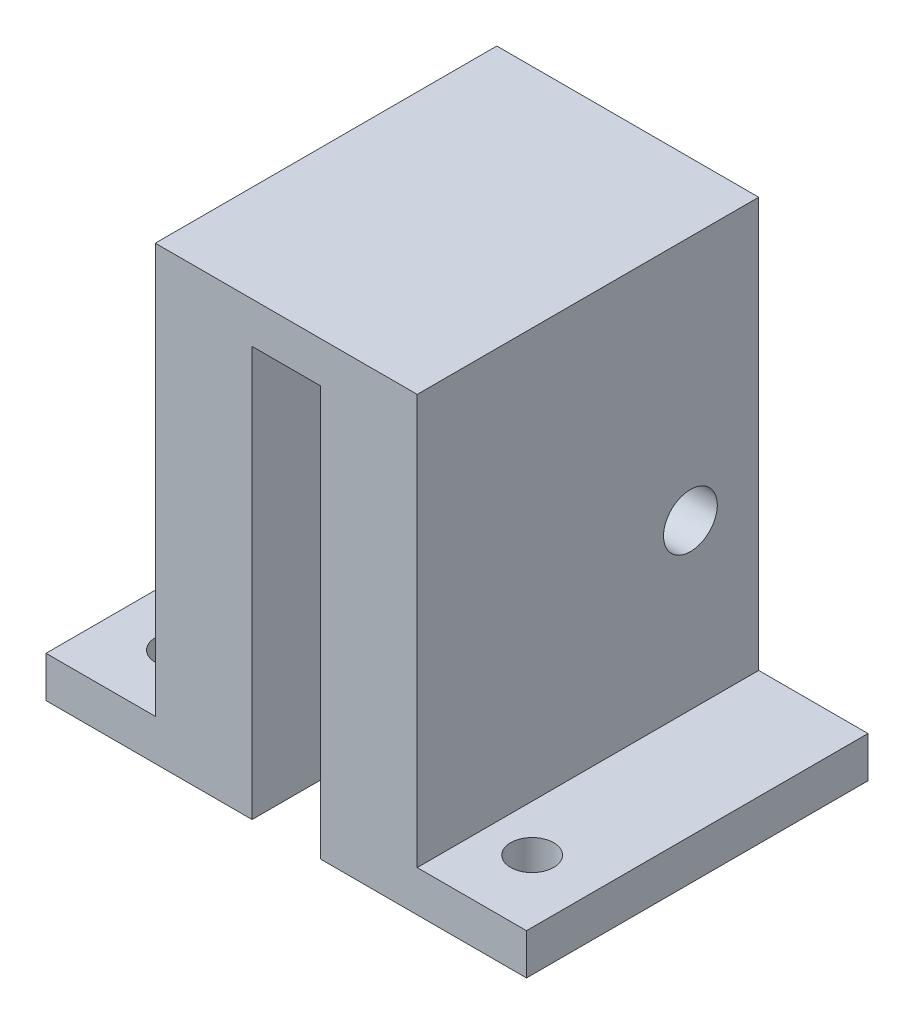
ISO-10303-21;
HEADER;
FILE_DESCRIPTION(('STEP AP214'),'2;1');
FILE_NAME('part.step','',(''),(''),'','','');
FILE_SCHEMA(('AUTOMOTIVE_DESIGN { 1 0 10303 214 1 1 1 1 }'));
ENDSEC;
DATA;
#1=APPLICATION_CONTEXT('core data for automotive mechanical design processes');
#2=APPLICATION_PROTOCOL_DEFINITION('international standard','automotive_design',2000,#1);
#3=PRODUCT_CONTEXT('',#1,'mechanical');
#4=PRODUCT('Part','Part','',(#3));
#5=PRODUCT_RELATED_PRODUCT_CATEGORY('part','',(#4));
#6=PRODUCT_DEFINITION_FORMATION('','',#4);
#7=PRODUCT_DEFINITION_CONTEXT('part definition',#1,'design');
#8=PRODUCT_DEFINITION('design','',#6,#7);
#9=PRODUCT_DEFINITION_SHAPE('','',#8);
#10=(LENGTH_UNIT() NAMED_UNIT(*) SI_UNIT(.MILLI.,.METRE.));
#11=(NAMED_UNIT(*) PLANE_ANGLE_UNIT() SI_UNIT($,.RADIAN.));
#12=(NAMED_UNIT(*) SI_UNIT($,.STERADIAN.) SOLID_ANGLE_UNIT());
#13=UNCERTAINTY_MEASURE_WITH_UNIT(LENGTH_MEASURE(1.E-05),#10,'distance_accuracy_value','');
#14=(GEOMETRIC_REPRESENTATION_CONTEXT(3) GLOBAL_UNCERTAINTY_ASSIGNED_CONTEXT((#13)) GLOBAL_UNIT_ASSIGNED_CONTEXT((#10,
#11,#12)) REPRESENTATION_CONTEXT('',''));
#15=CARTESIAN_POINT('',(0.,0.,0.));
#16=DIRECTION('',(0.,0.,1.));
#17=DIRECTION('',(1.,0.,0.));
#18=AXIS2_PLACEMENT_3D('',#15,#16,#17);
#19=CARTESIAN_POINT('',(-3.175,-38.1,31.75));
#20=DIRECTION('',(-1.,0.,0.));
#21=DIRECTION('',(0.,-1.,0.));
#22=AXIS2_PLACEMENT_3D('',#19,#20,#21);
#23=PLANE('',#22);
#24=DIRECTION('',(0.,1.,0.));
#25=VECTOR('',#24,1.);
#26=CARTESIAN_POINT('',(-3.175,-38.1,0.));
#27=LINE('',#26,#25);
#28=CARTESIAN_POINT('',(-3.175,-38.1,0.));
#29=VERTEX_POINT('',#28);
#30=CARTESIAN_POINT('',(-3.175,0.,0.));
#31=VERTEX_POINT('',#30);
#32=EDGE_CURVE('E216',#29,#31,#27,.T.);
#33=ORIENTED_EDGE('',*,*,#32,.T.);
#34=DIRECTION('',(0.,0.,-1.));
#35=VECTOR('',#34,1.);
#36=CARTESIAN_POINT('',(-3.175,0.,31.75));
#37=LINE('',#36,#35);
#38=CARTESIAN_POINT('',(-3.175,0.,31.75));
#39=VERTEX_POINT('',#38);
#40=EDGE_CURVE('E11',#39,#31,#37,.T.);
#41=ORIENTED_EDGE('',*,*,#40,.F.);
#42=DIRECTION('',(0.,1.,0.));
#43=VECTOR('',#42,1.);
#44=CARTESIAN_POINT('',(-3.175,-38.1,31.75));
#45=LINE('',#44,#43);
#46=CARTESIAN_POINT('',(-3.175,-38.1,31.75));
#47=VERTEX_POINT('',#46);
#48=EDGE_CURVE('E189',#47,#39,#45,.T.);
#49=ORIENTED_EDGE('',*,*,#48,.F.);
#50=DIRECTION('',(0.,0.,-1.));
#51=VECTOR('',#50,1.);
#52=CARTESIAN_POINT('',(-3.175,-38.1,31.75));
#53=LINE('',#52,#51);
#54=EDGE_CURVE('E215',#47,#29,#53,.T.);
#55=ORIENTED_EDGE('',*,*,#54,.T.);
#56=EDGE_LOOP('',(#33,#41,#49,#55));
#57=FACE_BOUND('',#56,.T.);
#58=DIRECTION('',(0.,-1.,0.));
#59=VECTOR('',#58,1.);
#60=CARTESIAN_POINT('',(-3.175,-20.4356406460551,8.55));
#61=LINE('',#60,#59);
#62=CARTESIAN_POINT('',(-3.175,-17.6643593539449,8.55));
#63=VERTEX_POINT('',#62);
#64=CARTESIAN_POINT('',(-3.175,-20.4356406460551,8.55));
#65=VERTEX_POINT('',#64);
#66=EDGE_CURVE('E165',#63,#65,#61,.T.);
#67=ORIENTED_EDGE('',*,*,#66,.F.);
#68=CARTESIAN_POINT('',(-3.175,-19.05,6.35));
#69=DIRECTION('',(-1.,0.,0.));
#70=DIRECTION('',(0.,-1.,0.));
#71=AXIS2_PLACEMENT_3D('',#68,#69,#70);
#72=CIRCLE('',#71,2.6);
#73=CARTESIAN_POINT('',(-3.175,-17.6643593539449,4.15));
#74=VERTEX_POINT('',#73);
#75=EDGE_CURVE('E149',#74,#63,#72,.F.);
#76=ORIENTED_EDGE('',*,*,#75,.F.);
#77=DIRECTION('',(0.,-1.,0.));
#78=VECTOR('',#77,1.);
#79=CARTESIAN_POINT('',(-3.175,-20.4356406460551,4.15));
#80=LINE('',#79,#78);
#81=CARTESIAN_POINT('',(-3.175,-20.4356406460551,4.14999999999999));
#82=VERTEX_POINT('',#81);
#83=EDGE_CURVE('E180',#74,#82,#80,.T.);
#84=ORIENTED_EDGE('',*,*,#83,.T.);
#85=CARTESIAN_POINT('',(-3.175,-19.05,6.35));
#86=DIRECTION('',(-1.,0.,0.));
#87=DIRECTION('',(0.,-1.,0.));
#88=AXIS2_PLACEMENT_3D('',#85,#86,#87);
#89=CIRCLE('',#88,2.6);
#90=EDGE_CURVE('E53',#65,#82,#89,.F.);
#91=ORIENTED_EDGE('',*,*,#90,.F.);
#92=EDGE_LOOP('',(#67,#76,#84,#91));
#93=FACE_BOUND('',#92,.T.);
#94=ADVANCED_FACE('F38',(#57,#93),#23,.F.);
#95=CARTESIAN_POINT('',(-12.175,3.81,31.75));
#96=DIRECTION('',(1.,0.,0.));
#97=DIRECTION('',(0.,1.,0.));
#98=AXIS2_PLACEMENT_3D('',#95,#96,#97);
#99=PLANE('',#98);
#100=DIRECTION('',(0.,-1.,0.));
#101=VECTOR('',#100,1.);
#102=CARTESIAN_POINT('',(-12.175,3.81,0.));
#103=LINE('',#102,#101);
#104=CARTESIAN_POINT('',(-12.175,3.81,0.));
#105=VERTEX_POINT('',#104);
#106=CARTESIAN_POINT('',(-12.175,-34.29,0.));
#107=VERTEX_POINT('',#106);
#108=EDGE_CURVE('E233',#105,#107,#103,.T.);
#109=ORIENTED_EDGE('',*,*,#108,.T.);
#110=DIRECTION('',(0.,0.,-1.));
#111=VECTOR('',#110,1.);
#112=CARTESIAN_POINT('',(-12.175,-34.29,31.75));
#113=LINE('',#112,#111);
#114=CARTESIAN_POINT('',(-12.175,-34.29,31.75));
#115=VERTEX_POINT('',#114);
#116=EDGE_CURVE('E248',#115,#107,#113,.T.);
#117=ORIENTED_EDGE('',*,*,#116,.F.);
#118=DIRECTION('',(0.,-1.,0.));
#119=VECTOR('',#118,1.);
#120=CARTESIAN_POINT('',(-12.175,3.81,31.75));
#121=LINE('',#120,#119);
#122=CARTESIAN_POINT('',(-12.175,3.81,31.75));
#123=VERTEX_POINT('',#122);
#124=EDGE_CURVE('E207',#123,#115,#121,.T.);
#125=ORIENTED_EDGE('',*,*,#124,.F.);
#126=DIRECTION('',(0.,0.,-1.));
#127=VECTOR('',#126,1.);
#128=CARTESIAN_POINT('',(-12.175,3.81,31.75));
#129=LINE('',#128,#127);
#130=EDGE_CURVE('E251',#123,#105,#129,.T.);
#131=ORIENTED_EDGE('',*,*,#130,.T.);
#132=EDGE_LOOP('',(#109,#117,#125,#131));
#133=FACE_BOUND('',#132,.T.);
#134=DIRECTION('',(0.,1.,0.));
#135=VECTOR('',#134,1.);
#136=CARTESIAN_POINT('',(-12.175,-20.4356406460551,4.15));
#137=LINE('',#136,#135);
#138=CARTESIAN_POINT('',(-12.175,-20.4356406460551,4.15));
#139=VERTEX_POINT('',#138);
#140=CARTESIAN_POINT('',(-12.175,-17.6643593539449,4.15));
#141=VERTEX_POINT('',#140);
#142=EDGE_CURVE('E175',#139,#141,#137,.T.);
#143=ORIENTED_EDGE('',*,*,#142,.T.);
#144=CARTESIAN_POINT('',(-12.175,-19.05,6.35));
#145=DIRECTION('',(-1.,0.,0.));
#146=DIRECTION('',(0.,1.,0.));
#147=AXIS2_PLACEMENT_3D('',#144,#145,#146);
#148=CIRCLE('',#147,2.6);
#149=CARTESIAN_POINT('',(-12.175,-17.6643593539449,8.55));
#150=VERTEX_POINT('',#149);
#151=EDGE_CURVE('E61',#150,#141,#148,.T.);
#152=ORIENTED_EDGE('',*,*,#151,.F.);
#153=DIRECTION('',(0.,1.,0.));
#154=VECTOR('',#153,1.);
#155=CARTESIAN_POINT('',(-12.175,-20.4356406460551,8.55));
#156=LINE('',#155,#154);
#157=CARTESIAN_POINT('',(-12.175,-20.4356406460551,8.55));
#158=VERTEX_POINT('',#157);
#159=EDGE_CURVE('E167',#158,#150,#156,.T.);
#160=ORIENTED_EDGE('',*,*,#159,.F.);
#161=CARTESIAN_POINT('',(-12.175,-19.05,6.35));
#162=DIRECTION('',(-1.,0.,0.));
#163=DIRECTION('',(0.,-1.,0.));
#164=AXIS2_PLACEMENT_3D('',#161,#162,#163);
#165=CIRCLE('',#164,2.6);
#166=EDGE_CURVE('E158',#139,#158,#165,.T.);
#167=ORIENTED_EDGE('',*,*,#166,.F.);
#168=EDGE_LOOP('',(#143,#152,#160,#167));
#169=FACE_BOUND('',#168,.T.);
#170=ADVANCED_FACE('F319',(#133,#169),#99,.F.);
#171=CARTESIAN_POINT('',(-3.175,0.,31.75));
#172=DIRECTION('',(0.,1.,0.));
#173=DIRECTION('',(0.,0.,1.));
#174=AXIS2_PLACEMENT_3D('',#171,#172,#173);
#175=PLANE('',#174);
#176=DIRECTION('',(1.,0.,0.));
#177=VECTOR('',#176,1.);
#178=CARTESIAN_POINT('',(-3.175,0.,0.));
#179=LINE('',#178,#177);
#180=CARTESIAN_POINT('',(3.175,0.,0.));
#181=VERTEX_POINT('',#180);
#182=EDGE_CURVE('E219',#31,#181,#179,.T.);
#183=ORIENTED_EDGE('',*,*,#182,.T.);
#184=DIRECTION('',(0.,0.,-1.));
#185=VECTOR('',#184,1.);
#186=CARTESIAN_POINT('',(3.175,0.,31.75));
#187=LINE('',#186,#185);
#188=CARTESIAN_POINT('',(3.175,0.,31.75));
#189=VERTEX_POINT('',#188);
#190=EDGE_CURVE('E46',#189,#181,#187,.T.);
#191=ORIENTED_EDGE('',*,*,#190,.F.);
#192=DIRECTION('',(1.,0.,0.));
#193=VECTOR('',#192,1.);
#194=CARTESIAN_POINT('',(-3.175,0.,31.75));
#195=LINE('',#194,#193);
#196=EDGE_CURVE('E192',#39,#189,#195,.T.);
#197=ORIENTED_EDGE('',*,*,#196,.F.);
#198=ORIENTED_EDGE('',*,*,#40,.T.);
#199=EDGE_LOOP('',(#183,#191,#197,#198));
#200=FACE_BOUND('',#199,.T.);
#201=ADVANCED_FACE('F297',(#200),#175,.F.);
#202=CARTESIAN_POINT('',(3.175,0.,31.75));
#203=DIRECTION('',(1.,0.,0.));
#204=DIRECTION('',(0.,1.,0.));
#205=AXIS2_PLACEMENT_3D('',#202,#203,#204);
#206=PLANE('',#205);
#207=CARTESIAN_POINT('',(3.175,-19.05,6.35));
#208=DIRECTION('',(1.,0.,0.));
#209=DIRECTION('',(0.,1.,0.));
#210=AXIS2_PLACEMENT_3D('',#207,#208,#209);
#211=CIRCLE('',#210,2.5);
#212=CARTESIAN_POINT('',(3.175,-16.55,6.35));
#213=VERTEX_POINT('',#212);
#214=EDGE_CURVE('E521',#213,#213,#211,.F.);
#215=ORIENTED_EDGE('',*,*,#214,.F.);
#216=EDGE_LOOP('',(#215));
#217=FACE_BOUND('',#216,.T.);
#218=DIRECTION('',(0.,-1.,0.));
#219=VECTOR('',#218,1.);
#220=CARTESIAN_POINT('',(3.175,0.,0.));
#221=LINE('',#220,#219);
#222=CARTESIAN_POINT('',(3.175,-38.1,0.));
#223=VERTEX_POINT('',#222);
#224=EDGE_CURVE('E221',#181,#223,#221,.T.);
#225=ORIENTED_EDGE('',*,*,#224,.T.);
#226=DIRECTION('',(0.,0.,-1.));
#227=VECTOR('',#226,1.);
#228=CARTESIAN_POINT('',(3.175,-38.1,31.75));
#229=LINE('',#228,#227);
#230=CARTESIAN_POINT('',(3.175,-38.1,31.75));
#231=VERTEX_POINT('',#230);
#232=EDGE_CURVE('E266',#231,#223,#229,.T.);
#233=ORIENTED_EDGE('',*,*,#232,.F.);
#234=DIRECTION('',(0.,-1.,0.));
#235=VECTOR('',#234,1.);
#236=CARTESIAN_POINT('',(3.175,0.,31.75));
#237=LINE('',#236,#235);
#238=EDGE_CURVE('E195',#189,#231,#237,.T.);
#239=ORIENTED_EDGE('',*,*,#238,.F.);
#240=ORIENTED_EDGE('',*,*,#190,.T.);
#241=EDGE_LOOP('',(#225,#233,#239,#240));
#242=FACE_BOUND('',#241,.T.);
#243=ADVANCED_FACE('F274',(#217,#242),#206,.F.);
#244=CARTESIAN_POINT('',(3.175,-38.1,31.75));
#245=DIRECTION('',(0.,1.,0.));
#246=DIRECTION('',(0.,0.,1.));
#247=AXIS2_PLACEMENT_3D('',#244,#245,#246);
#248=PLANE('',#247);
#249=CARTESIAN_POINT('',(16.51,-38.1,25.4));
#250=DIRECTION('',(0.,-1.,0.));
#251=DIRECTION('',(0.,0.,-1.));
#252=AXIS2_PLACEMENT_3D('',#249,#250,#251);
#253=CIRCLE('',#252,2.00000000000001);
#254=CARTESIAN_POINT('',(16.51,-38.1,23.4));
#255=VERTEX_POINT('',#254);
#256=EDGE_CURVE('E170',#255,#255,#253,.T.);
#257=ORIENTED_EDGE('',*,*,#256,.F.);
#258=EDGE_LOOP('',(#257));
#259=FACE_BOUND('',#258,.T.);
#260=DIRECTION('',(1.,0.,0.));
#261=VECTOR('',#260,1.);
#262=CARTESIAN_POINT('',(3.175,-38.1,0.));
#263=LINE('',#262,#261);
#264=CARTESIAN_POINT('',(22.335,-38.1,0.));
#265=VERTEX_POINT('',#264);
#266=EDGE_CURVE('E223',#223,#265,#263,.T.);
#267=ORIENTED_EDGE('',*,*,#266,.T.);
#268=DIRECTION('',(0.,0.,-1.));
#269=VECTOR('',#268,1.);
#270=CARTESIAN_POINT('',(22.335,-38.1,31.75));
#271=LINE('',#270,#269);
#272=CARTESIAN_POINT('',(22.335,-38.1,31.75));
#273=VERTEX_POINT('',#272);
#274=EDGE_CURVE('E263',#273,#265,#271,.T.);
#275=ORIENTED_EDGE('',*,*,#274,.F.);
#276=DIRECTION('',(1.,0.,0.));
#277=VECTOR('',#276,1.);
#278=CARTESIAN_POINT('',(3.175,-38.1,31.75));
#279=LINE('',#278,#277);
#280=EDGE_CURVE('E197',#231,#273,#279,.T.);
#281=ORIENTED_EDGE('',*,*,#280,.F.);
#282=ORIENTED_EDGE('',*,*,#232,.T.);
#283=EDGE_LOOP('',(#267,#275,#281,#282));
#284=FACE_BOUND('',#283,.T.);
#285=ADVANCED_FACE('F285',(#259,#284),#248,.F.);
#286=CARTESIAN_POINT('',(22.335,-38.1,31.75));
#287=DIRECTION('',(-1.,0.,0.));
#288=DIRECTION('',(0.,-1.,0.));
#289=AXIS2_PLACEMENT_3D('',#286,#287,#288);
#290=PLANE('',#289);
#291=DIRECTION('',(0.,1.,0.));
#292=VECTOR('',#291,1.);
#293=CARTESIAN_POINT('',(22.335,-38.1,0.));
#294=LINE('',#293,#292);
#295=CARTESIAN_POINT('',(22.335,-34.29,0.));
#296=VERTEX_POINT('',#295);
#297=EDGE_CURVE('E225',#265,#296,#294,.T.);
#298=ORIENTED_EDGE('',*,*,#297,.T.);
#299=DIRECTION('',(0.,0.,-1.));
#300=VECTOR('',#299,1.);
#301=CARTESIAN_POINT('',(22.335,-34.29,31.75));
#302=LINE('',#301,#300);
#303=CARTESIAN_POINT('',(22.335,-34.29,31.75));
#304=VERTEX_POINT('',#303);
#305=EDGE_CURVE('E260',#304,#296,#302,.T.);
#306=ORIENTED_EDGE('',*,*,#305,.F.);
#307=DIRECTION('',(0.,1.,0.));
#308=VECTOR('',#307,1.);
#309=CARTESIAN_POINT('',(22.335,-38.1,31.75));
#310=LINE('',#309,#308);
#311=EDGE_CURVE('E199',#273,#304,#310,.T.);
#312=ORIENTED_EDGE('',*,*,#311,.F.);
#313=ORIENTED_EDGE('',*,*,#274,.T.);
#314=EDGE_LOOP('',(#298,#306,#312,#313));
#315=FACE_BOUND('',#314,.T.);
#316=ADVANCED_FACE('F289',(#315),#290,.F.);
#317=CARTESIAN_POINT('',(22.335,-34.29,31.75));
#318=DIRECTION('',(0.,-1.,0.));
#319=DIRECTION('',(1.,0.,0.));
#320=AXIS2_PLACEMENT_3D('',#317,#318,#319);
#321=PLANE('',#320);
#322=CARTESIAN_POINT('',(16.51,-34.29,25.4));
#323=DIRECTION('',(0.,-1.,0.));
#324=DIRECTION('',(1.,0.,0.));
#325=AXIS2_PLACEMENT_3D('',#322,#323,#324);
#326=CIRCLE('',#325,2.00000000000001);
#327=CARTESIAN_POINT('',(18.51,-34.29,25.4));
#328=VERTEX_POINT('',#327);
#329=EDGE_CURVE('E41',#328,#328,#326,.T.);
#330=ORIENTED_EDGE('',*,*,#329,.T.);
#331=EDGE_LOOP('',(#330));
#332=FACE_BOUND('',#331,.T.);
#333=DIRECTION('',(-1.,0.,0.));
#334=VECTOR('',#333,1.);
#335=CARTESIAN_POINT('',(22.335,-34.29,0.));
#336=LINE('',#335,#334);
#337=CARTESIAN_POINT('',(12.175,-34.29,0.));
#338=VERTEX_POINT('',#337);
#339=EDGE_CURVE('E227',#296,#338,#336,.T.);
#340=ORIENTED_EDGE('',*,*,#339,.T.);
#341=DIRECTION('',(0.,0.,-1.));
#342=VECTOR('',#341,1.);
#343=CARTESIAN_POINT('',(12.175,-34.29,31.75));
#344=LINE('',#343,#342);
#345=CARTESIAN_POINT('',(12.175,-34.29,31.75));
#346=VERTEX_POINT('',#345);
#347=EDGE_CURVE('E257',#346,#338,#344,.T.);
#348=ORIENTED_EDGE('',*,*,#347,.F.);
#349=DIRECTION('',(-1.,0.,0.));
#350=VECTOR('',#349,1.);
#351=CARTESIAN_POINT('',(22.335,-34.29,31.75));
#352=LINE('',#351,#350);
#353=EDGE_CURVE('E201',#304,#346,#352,.T.);
#354=ORIENTED_EDGE('',*,*,#353,.F.);
#355=ORIENTED_EDGE('',*,*,#305,.T.);
#356=EDGE_LOOP('',(#340,#348,#354,#355));
#357=FACE_BOUND('',#356,.T.);
#358=ADVANCED_FACE('F331',(#332,#357),#321,.F.);
#359=CARTESIAN_POINT('',(12.175,-34.29,31.75));
#360=DIRECTION('',(-1.,0.,0.));
#361=DIRECTION('',(0.,-1.,0.));
#362=AXIS2_PLACEMENT_3D('',#359,#360,#361);
#363=PLANE('',#362);
#364=CARTESIAN_POINT('',(12.175,-19.05,6.35));
#365=DIRECTION('',(1.,0.,0.));
#366=DIRECTION('',(0.,1.,0.));
#367=AXIS2_PLACEMENT_3D('',#364,#365,#366);
#368=CIRCLE('',#367,2.5);
#369=CARTESIAN_POINT('',(12.175,-16.55,6.35));
#370=VERTEX_POINT('',#369);
#371=EDGE_CURVE('E523',#370,#370,#368,.T.);
#372=ORIENTED_EDGE('',*,*,#371,.F.);
#373=EDGE_LOOP('',(#372));
#374=FACE_BOUND('',#373,.T.);
#375=DIRECTION('',(0.,1.,0.));
#376=VECTOR('',#375,1.);
#377=CARTESIAN_POINT('',(12.175,-34.29,0.));
#378=LINE('',#377,#376);
#379=CARTESIAN_POINT('',(12.175,3.81,0.));
#380=VERTEX_POINT('',#379);
#381=EDGE_CURVE('E229',#338,#380,#378,.T.);
#382=ORIENTED_EDGE('',*,*,#381,.T.);
#383=DIRECTION('',(0.,0.,-1.));
#384=VECTOR('',#383,1.);
#385=CARTESIAN_POINT('',(12.175,3.81,31.75));
#386=LINE('',#385,#384);
#387=CARTESIAN_POINT('',(12.175,3.81,31.75));
#388=VERTEX_POINT('',#387);
#389=EDGE_CURVE('E254',#388,#380,#386,.T.);
#390=ORIENTED_EDGE('',*,*,#389,.F.);
#391=DIRECTION('',(0.,1.,0.));
#392=VECTOR('',#391,1.);
#393=CARTESIAN_POINT('',(12.175,-34.29,31.75));
#394=LINE('',#393,#392);
#395=EDGE_CURVE('E203',#346,#388,#394,.T.);
#396=ORIENTED_EDGE('',*,*,#395,.F.);
#397=ORIENTED_EDGE('',*,*,#347,.T.);
#398=EDGE_LOOP('',(#382,#390,#396,#397));
#399=FACE_BOUND('',#398,.T.);
#400=ADVANCED_FACE('F329',(#374,#399),#363,.F.);
#401=CARTESIAN_POINT('',(12.175,3.81,31.75));
#402=DIRECTION('',(0.,-1.,0.));
#403=DIRECTION('',(0.,0.,-1.));
#404=AXIS2_PLACEMENT_3D('',#401,#402,#403);
#405=PLANE('',#404);
#406=DIRECTION('',(-1.,0.,0.));
#407=VECTOR('',#406,1.);
#408=CARTESIAN_POINT('',(12.175,3.81,0.));
#409=LINE('',#408,#407);
#410=EDGE_CURVE('E231',#380,#105,#409,.T.);
#411=ORIENTED_EDGE('',*,*,#410,.T.);
#412=ORIENTED_EDGE('',*,*,#130,.F.);
#413=DIRECTION('',(-1.,0.,0.));
#414=VECTOR('',#413,1.);
#415=CARTESIAN_POINT('',(12.175,3.81,31.75));
#416=LINE('',#415,#414);
#417=EDGE_CURVE('E205',#388,#123,#416,.T.);
#418=ORIENTED_EDGE('',*,*,#417,.F.);
#419=ORIENTED_EDGE('',*,*,#389,.T.);
#420=EDGE_LOOP('',(#411,#412,#418,#419));
#421=FACE_BOUND('',#420,.T.);
#422=ADVANCED_FACE('F325',(#421),#405,.F.);
#423=CARTESIAN_POINT('',(-12.175,-34.29,31.75));
#424=DIRECTION('',(0.,-1.,0.));
#425=DIRECTION('',(0.,0.,-1.));
#426=AXIS2_PLACEMENT_3D('',#423,#424,#425);
#427=PLANE('',#426);
#428=CARTESIAN_POINT('',(-16.51,-34.29,25.4));
#429=DIRECTION('',(0.,-1.,0.));
#430=DIRECTION('',(0.,0.,-1.));
#431=AXIS2_PLACEMENT_3D('',#428,#429,#430);
#432=CIRCLE('',#431,2.00000000000001);
#433=CARTESIAN_POINT('',(-16.51,-34.29,23.4));
#434=VERTEX_POINT('',#433);
#435=EDGE_CURVE('E185',#434,#434,#432,.F.);
#436=ORIENTED_EDGE('',*,*,#435,.F.);
#437=EDGE_LOOP('',(#436));
#438=FACE_BOUND('',#437,.T.);
#439=DIRECTION('',(-1.,0.,0.));
#440=VECTOR('',#439,1.);
#441=CARTESIAN_POINT('',(-12.175,-34.29,0.));
#442=LINE('',#441,#440);
#443=CARTESIAN_POINT('',(-22.335,-34.29,0.));
#444=VERTEX_POINT('',#443);
#445=EDGE_CURVE('E235',#107,#444,#442,.T.);
#446=ORIENTED_EDGE('',*,*,#445,.T.);
#447=DIRECTION('',(0.,0.,-1.));
#448=VECTOR('',#447,1.);
#449=CARTESIAN_POINT('',(-22.335,-34.29,31.75));
#450=LINE('',#449,#448);
#451=CARTESIAN_POINT('',(-22.335,-34.29,31.75));
#452=VERTEX_POINT('',#451);
#453=EDGE_CURVE('E245',#452,#444,#450,.T.);
#454=ORIENTED_EDGE('',*,*,#453,.F.);
#455=DIRECTION('',(-1.,0.,0.));
#456=VECTOR('',#455,1.);
#457=CARTESIAN_POINT('',(-12.175,-34.29,31.75));
#458=LINE('',#457,#456);
#459=EDGE_CURVE('E209',#115,#452,#458,.T.);
#460=ORIENTED_EDGE('',*,*,#459,.F.);
#461=ORIENTED_EDGE('',*,*,#116,.T.);
#462=EDGE_LOOP('',(#446,#454,#460,#461));
#463=FACE_BOUND('',#462,.T.);
#464=ADVANCED_FACE('F313',(#438,#463),#427,.F.);
#465=CARTESIAN_POINT('',(-22.335,-34.29,31.75));
#466=DIRECTION('',(1.,0.,0.));
#467=DIRECTION('',(0.,0.,-1.));
#468=AXIS2_PLACEMENT_3D('',#465,#466,#467);
#469=PLANE('',#468);
#470=DIRECTION('',(0.,-1.,0.));
#471=VECTOR('',#470,1.);
#472=CARTESIAN_POINT('',(-22.335,-34.29,0.));
#473=LINE('',#472,#471);
#474=CARTESIAN_POINT('',(-22.335,-38.1,0.));
#475=VERTEX_POINT('',#474);
#476=EDGE_CURVE('E237',#444,#475,#473,.T.);
#477=ORIENTED_EDGE('',*,*,#476,.T.);
#478=DIRECTION('',(0.,0.,-1.));
#479=VECTOR('',#478,1.);
#480=CARTESIAN_POINT('',(-22.335,-38.1,31.75));
#481=LINE('',#480,#479);
#482=CARTESIAN_POINT('',(-22.335,-38.1,31.75));
#483=VERTEX_POINT('',#482);
#484=EDGE_CURVE('E242',#483,#475,#481,.T.);
#485=ORIENTED_EDGE('',*,*,#484,.F.);
#486=DIRECTION('',(0.,-1.,0.));
#487=VECTOR('',#486,1.);
#488=CARTESIAN_POINT('',(-22.335,-34.29,31.75));
#489=LINE('',#488,#487);
#490=EDGE_CURVE('E211',#452,#483,#489,.T.);
#491=ORIENTED_EDGE('',*,*,#490,.F.);
#492=ORIENTED_EDGE('',*,*,#453,.T.);
#493=EDGE_LOOP('',(#477,#485,#491,#492));
#494=FACE_BOUND('',#493,.T.);
#495=ADVANCED_FACE('F309',(#494),#469,.F.);
#496=CARTESIAN_POINT('',(-22.335,-38.1,31.75));
#497=DIRECTION('',(0.,1.,0.));
#498=DIRECTION('',(0.,0.,1.));
#499=AXIS2_PLACEMENT_3D('',#496,#497,#498);
#500=PLANE('',#499);
#501=CARTESIAN_POINT('',(-16.51,-38.1,25.4));
#502=DIRECTION('',(0.,-1.,0.));
#503=DIRECTION('',(0.,0.,-1.));
#504=AXIS2_PLACEMENT_3D('',#501,#502,#503);
#505=CIRCLE('',#504,2.00000000000001);
#506=CARTESIAN_POINT('',(-16.51,-38.1,23.4));
#507=VERTEX_POINT('',#506);
#508=EDGE_CURVE('E173',#507,#507,#505,.F.);
#509=ORIENTED_EDGE('',*,*,#508,.T.);
#510=EDGE_LOOP('',(#509));
#511=FACE_BOUND('',#510,.T.);
#512=DIRECTION('',(1.,0.,0.));
#513=VECTOR('',#512,1.);
#514=CARTESIAN_POINT('',(-22.335,-38.1,0.));
#515=LINE('',#514,#513);
#516=EDGE_CURVE('E193',#475,#29,#515,.T.);
#517=ORIENTED_EDGE('',*,*,#516,.T.);
#518=ORIENTED_EDGE('',*,*,#54,.F.);
#519=DIRECTION('',(1.,0.,0.));
#520=VECTOR('',#519,1.);
#521=CARTESIAN_POINT('',(-22.335,-38.1,31.75));
#522=LINE('',#521,#520);
#523=EDGE_CURVE('E213',#483,#47,#522,.T.);
#524=ORIENTED_EDGE('',*,*,#523,.F.);
#525=ORIENTED_EDGE('',*,*,#484,.T.);
#526=EDGE_LOOP('',(#517,#518,#524,#525));
#527=FACE_BOUND('',#526,.T.);
#528=ADVANCED_FACE('F304',(#511,#527),#500,.F.);
#529=CARTESIAN_POINT('',(0.,0.,31.75));
#530=DIRECTION('',(0.,0.,-1.));
#531=DIRECTION('',(-1.,0.,0.));
#532=AXIS2_PLACEMENT_3D('',#529,#530,#531);
#533=PLANE('',#532);
#534=ORIENTED_EDGE('',*,*,#48,.T.);
#535=ORIENTED_EDGE('',*,*,#196,.T.);
#536=ORIENTED_EDGE('',*,*,#238,.T.);
#537=ORIENTED_EDGE('',*,*,#280,.T.);
#538=ORIENTED_EDGE('',*,*,#311,.T.);
#539=ORIENTED_EDGE('',*,*,#353,.T.);
#540=ORIENTED_EDGE('',*,*,#395,.T.);
#541=ORIENTED_EDGE('',*,*,#417,.T.);
#542=ORIENTED_EDGE('',*,*,#124,.T.);
#543=ORIENTED_EDGE('',*,*,#459,.T.);
#544=ORIENTED_EDGE('',*,*,#490,.T.);
#545=ORIENTED_EDGE('',*,*,#523,.T.);
#546=EDGE_LOOP('',(#534,#535,#536,#537,#538,#539,#540,#541,#542,#543,#544,#545));
#547=FACE_BOUND('',#546,.T.);
#548=ADVANCED_FACE('F293',(#547),#533,.F.);
#549=CARTESIAN_POINT('',(0.,0.,0.));
#550=DIRECTION('',(0.,0.,-1.));
#551=DIRECTION('',(-1.,0.,0.));
#552=AXIS2_PLACEMENT_3D('',#549,#550,#551);
#553=PLANE('',#552);
#554=ORIENTED_EDGE('',*,*,#32,.F.);
#555=ORIENTED_EDGE('',*,*,#516,.F.);
#556=ORIENTED_EDGE('',*,*,#476,.F.);
#557=ORIENTED_EDGE('',*,*,#445,.F.);
#558=ORIENTED_EDGE('',*,*,#108,.F.);
#559=ORIENTED_EDGE('',*,*,#410,.F.);
#560=ORIENTED_EDGE('',*,*,#381,.F.);
#561=ORIENTED_EDGE('',*,*,#339,.F.);
#562=ORIENTED_EDGE('',*,*,#297,.F.);
#563=ORIENTED_EDGE('',*,*,#266,.F.);
#564=ORIENTED_EDGE('',*,*,#224,.F.);
#565=ORIENTED_EDGE('',*,*,#182,.F.);
#566=EDGE_LOOP('',(#554,#555,#556,#557,#558,#559,#560,#561,#562,#563,#564,#565));
#567=FACE_BOUND('',#566,.T.);
#568=ADVANCED_FACE('F280',(#567),#553,.T.);
#569=CARTESIAN_POINT('',(-16.51,3.81,25.4));
#570=DIRECTION('',(0.,-1.,0.));
#571=DIRECTION('',(0.,0.,-1.));
#572=AXIS2_PLACEMENT_3D('',#569,#570,#571);
#573=CYLINDRICAL_SURFACE('',#572,2.00000000000001);
#574=ORIENTED_EDGE('',*,*,#508,.F.);
#575=EDGE_LOOP('',(#574));
#576=FACE_BOUND('',#575,.T.);
#577=ORIENTED_EDGE('',*,*,#435,.T.);
#578=EDGE_LOOP('',(#577));
#579=FACE_BOUND('',#578,.T.);
#580=ADVANCED_FACE('F368',(#576,#579),#573,.F.);
#581=CARTESIAN_POINT('',(16.51,3.81,25.4));
#582=DIRECTION('',(0.,-1.,0.));
#583=DIRECTION('',(0.,0.,-1.));
#584=AXIS2_PLACEMENT_3D('',#581,#582,#583);
#585=CYLINDRICAL_SURFACE('',#584,2.00000000000001);
#586=ORIENTED_EDGE('',*,*,#256,.T.);
#587=EDGE_LOOP('',(#586));
#588=FACE_BOUND('',#587,.T.);
#589=ORIENTED_EDGE('',*,*,#329,.F.);
#590=EDGE_LOOP('',(#589));
#591=FACE_BOUND('',#590,.T.);
#592=ADVANCED_FACE('F370',(#588,#591),#585,.F.);
#593=CARTESIAN_POINT('',(22.336,-20.4356406460551,8.55));
#594=DIRECTION('',(0.,0.,1.));
#595=DIRECTION('',(0.,-1.,0.));
#596=AXIS2_PLACEMENT_3D('',#593,#594,#595);
#597=PLANE('',#596);
#598=ORIENTED_EDGE('',*,*,#66,.T.);
#599=DIRECTION('',(-1.,0.,0.));
#600=VECTOR('',#599,1.);
#601=CARTESIAN_POINT('',(22.336,-20.4356406460551,8.55));
#602=LINE('',#601,#600);
#603=EDGE_CURVE('E168',#65,#158,#602,.T.);
#604=ORIENTED_EDGE('',*,*,#603,.T.);
#605=ORIENTED_EDGE('',*,*,#159,.T.);
#606=DIRECTION('',(-1.,0.,0.));
#607=VECTOR('',#606,1.);
#608=CARTESIAN_POINT('',(22.336,-17.6643593539449,8.55));
#609=LINE('',#608,#607);
#610=EDGE_CURVE('E152',#63,#150,#609,.T.);
#611=ORIENTED_EDGE('',*,*,#610,.F.);
#612=EDGE_LOOP('',(#598,#604,#605,#611));
#613=FACE_BOUND('',#612,.T.);
#614=ADVANCED_FACE('F163',(#613),#597,.F.);
#615=CARTESIAN_POINT('',(22.336,-20.4356406460551,4.15));
#616=DIRECTION('',(0.,0.,1.));
#617=DIRECTION('',(0.,-1.,0.));
#618=AXIS2_PLACEMENT_3D('',#615,#616,#617);
#619=PLANE('',#618);
#620=DIRECTION('',(-1.,0.,0.));
#621=VECTOR('',#620,1.);
#622=CARTESIAN_POINT('',(22.336,-17.6643593539449,4.15));
#623=LINE('',#622,#621);
#624=EDGE_CURVE('E153',#74,#141,#623,.T.);
#625=ORIENTED_EDGE('',*,*,#624,.T.);
#626=ORIENTED_EDGE('',*,*,#142,.F.);
#627=DIRECTION('',(-1.,0.,0.));
#628=VECTOR('',#627,1.);
#629=CARTESIAN_POINT('',(22.336,-20.4356406460551,4.15));
#630=LINE('',#629,#628);
#631=EDGE_CURVE('E181',#82,#139,#630,.T.);
#632=ORIENTED_EDGE('',*,*,#631,.F.);
#633=ORIENTED_EDGE('',*,*,#83,.F.);
#634=EDGE_LOOP('',(#625,#626,#632,#633));
#635=FACE_BOUND('',#634,.T.);
#636=ADVANCED_FACE('F431',(#635),#619,.T.);
#637=CARTESIAN_POINT('',(22.336,-19.05,6.35));
#638=DIRECTION('',(-1.,0.,0.));
#639=DIRECTION('',(0.,-1.,0.));
#640=AXIS2_PLACEMENT_3D('',#637,#638,#639);
#641=CYLINDRICAL_SURFACE('',#640,2.6);
#642=ORIENTED_EDGE('',*,*,#90,.T.);
#643=ORIENTED_EDGE('',*,*,#631,.T.);
#644=ORIENTED_EDGE('',*,*,#166,.T.);
#645=ORIENTED_EDGE('',*,*,#603,.F.);
#646=EDGE_LOOP('',(#642,#643,#644,#645));
#647=FACE_BOUND('',#646,.T.);
#648=ADVANCED_FACE('F439',(#647),#641,.F.);
#649=CARTESIAN_POINT('',(22.336,-19.05,6.35));
#650=DIRECTION('',(-1.,0.,0.));
#651=DIRECTION('',(0.,-1.,0.));
#652=AXIS2_PLACEMENT_3D('',#649,#650,#651);
#653=CYLINDRICAL_SURFACE('',#652,2.6);
#654=ORIENTED_EDGE('',*,*,#75,.T.);
#655=ORIENTED_EDGE('',*,*,#610,.T.);
#656=ORIENTED_EDGE('',*,*,#151,.T.);
#657=ORIENTED_EDGE('',*,*,#624,.F.);
#658=EDGE_LOOP('',(#654,#655,#656,#657));
#659=FACE_BOUND('',#658,.T.);
#660=ADVANCED_FACE('F151',(#659),#653,.F.);
#661=CARTESIAN_POINT('',(-22.336,-19.05,6.35));
#662=DIRECTION('',(1.,0.,0.));
#663=DIRECTION('',(0.,1.,0.));
#664=AXIS2_PLACEMENT_3D('',#661,#662,#663);
#665=CYLINDRICAL_SURFACE('',#664,2.5);
#666=ORIENTED_EDGE('',*,*,#371,.T.);
#667=EDGE_LOOP('',(#666));
#668=FACE_BOUND('',#667,.T.);
#669=ORIENTED_EDGE('',*,*,#214,.T.);
#670=EDGE_LOOP('',(#669));
#671=FACE_BOUND('',#670,.T.);
#672=ADVANCED_FACE('F456',(#668,#671),#665,.F.);
#673=CLOSED_SHELL('',(#94,#170,#201,#243,#285,#316,#358,#400,#422,#464,#495,#528,#548,#568,#580,
#592,#614,#636,#648,#660,#672));
#674=MANIFOLD_SOLID_BREP('B2',#673);
#675=ADVANCED_BREP_SHAPE_REPRESENTATION('',(#18,#674),#14);
#676=SHAPE_DEFINITION_REPRESENTATION(#9,#675);
ENDSEC;
END-ISO-10303-21;
